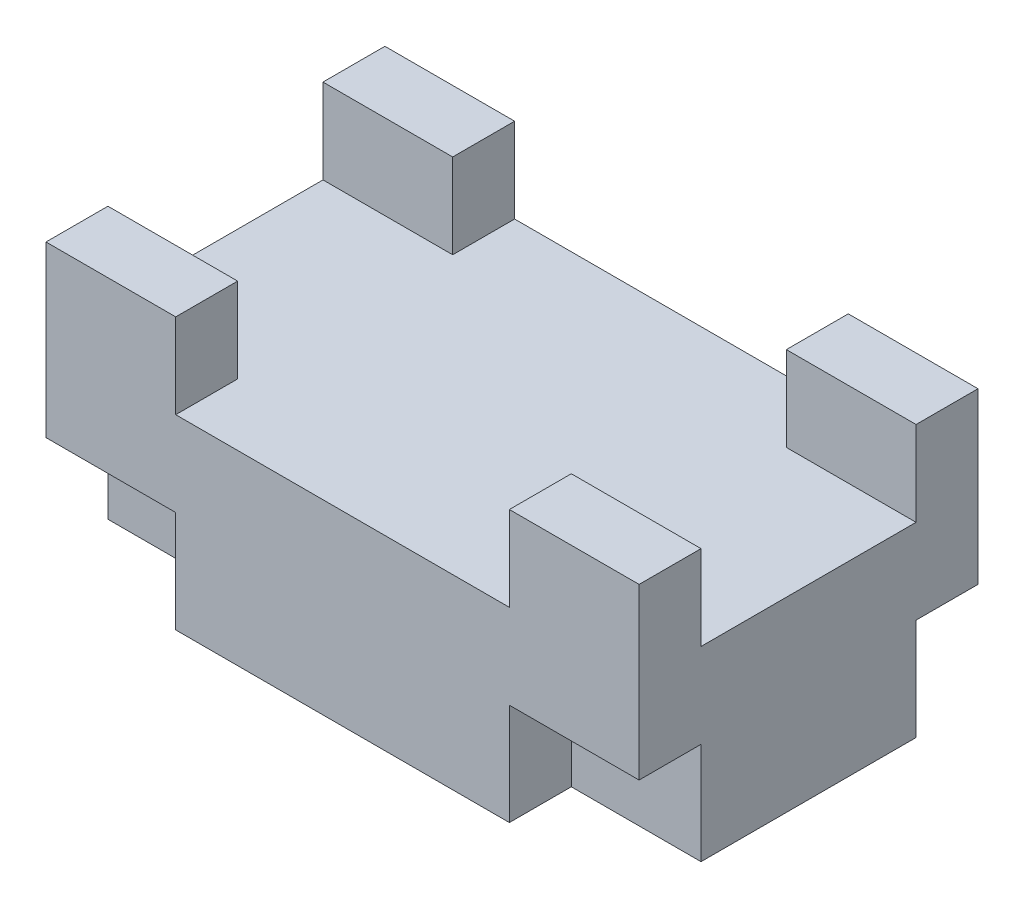
ISO-10303-21;
HEADER;
FILE_DESCRIPTION(('STEP AP214'),'2;1');
FILE_NAME('part.step','',(''),(''),'','','');
FILE_SCHEMA(('AUTOMOTIVE_DESIGN { 1 0 10303 214 1 1 1 1 }'));
ENDSEC;
DATA;
#1=APPLICATION_CONTEXT('core data for automotive mechanical design processes');
#2=APPLICATION_PROTOCOL_DEFINITION('international standard','automotive_design',2000,#1);
#3=PRODUCT_CONTEXT('',#1,'mechanical');
#4=PRODUCT('Part','Part','',(#3));
#5=PRODUCT_RELATED_PRODUCT_CATEGORY('part','',(#4));
#6=PRODUCT_DEFINITION_FORMATION('','',#4);
#7=PRODUCT_DEFINITION_CONTEXT('part definition',#1,'design');
#8=PRODUCT_DEFINITION('design','',#6,#7);
#9=PRODUCT_DEFINITION_SHAPE('','',#8);
#10=(LENGTH_UNIT() NAMED_UNIT(*) SI_UNIT(.MILLI.,.METRE.));
#11=(NAMED_UNIT(*) PLANE_ANGLE_UNIT() SI_UNIT($,.RADIAN.));
#12=(NAMED_UNIT(*) SI_UNIT($,.STERADIAN.) SOLID_ANGLE_UNIT());
#13=UNCERTAINTY_MEASURE_WITH_UNIT(LENGTH_MEASURE(1.E-05),#10,'distance_accuracy_value','');
#14=(GEOMETRIC_REPRESENTATION_CONTEXT(3) GLOBAL_UNCERTAINTY_ASSIGNED_CONTEXT((#13)) GLOBAL_UNIT_ASSIGNED_CONTEXT((#10,
#11,#12)) REPRESENTATION_CONTEXT('',''));
#15=CARTESIAN_POINT('',(0.,0.,0.));
#16=DIRECTION('',(0.,0.,1.));
#17=DIRECTION('',(1.,0.,0.));
#18=AXIS2_PLACEMENT_3D('',#15,#16,#17);
#19=CARTESIAN_POINT('',(0.,55.,-31.7241467208693));
#20=DIRECTION('',(0.,0.,-1.));
#21=DIRECTION('',(-1.,0.,0.));
#22=AXIS2_PLACEMENT_3D('',#19,#20,#21);
#23=PLANE('',#22);
#24=DIRECTION('',(0.,-1.,0.));
#25=VECTOR('',#24,1.);
#26=CARTESIAN_POINT('',(-87.5,55.,-31.7241467208693));
#27=LINE('',#26,#25);
#28=CARTESIAN_POINT('',(-87.5,30.,-31.7241467208693));
#29=VERTEX_POINT('',#28);
#30=CARTESIAN_POINT('',(-87.5,0.,-31.7241467208693));
#31=VERTEX_POINT('',#30);
#32=EDGE_CURVE('E11',#29,#31,#27,.T.);
#33=ORIENTED_EDGE('',*,*,#32,.F.);
#34=DIRECTION('',(1.,0.,0.));
#35=VECTOR('',#34,1.);
#36=CARTESIAN_POINT('',(-49.2266480162041,30.,-31.7241467208693));
#37=LINE('',#36,#35);
#38=CARTESIAN_POINT('',(-49.2266480162041,30.,-31.7241467208693));
#39=VERTEX_POINT('',#38);
#40=EDGE_CURVE('E62',#29,#39,#37,.T.);
#41=ORIENTED_EDGE('',*,*,#40,.T.);
#42=DIRECTION('',(0.,-1.,0.));
#43=VECTOR('',#42,1.);
#44=CARTESIAN_POINT('',(-49.2266480162041,55.,-31.7241467208693));
#45=LINE('',#44,#43);
#46=CARTESIAN_POINT('',(-49.2266480162041,0.,-31.7241467208693));
#47=VERTEX_POINT('',#46);
#48=EDGE_CURVE('E392',#39,#47,#45,.T.);
#49=ORIENTED_EDGE('',*,*,#48,.T.);
#50=DIRECTION('',(1.,0.,0.));
#51=VECTOR('',#50,1.);
#52=CARTESIAN_POINT('',(0.,0.,-31.7241467208693));
#53=LINE('',#52,#51);
#54=EDGE_CURVE('E349',#31,#47,#53,.T.);
#55=ORIENTED_EDGE('',*,*,#54,.F.);
#56=EDGE_LOOP('',(#33,#41,#49,#55));
#57=FACE_BOUND('',#56,.T.);
#58=ADVANCED_FACE('F39',(#57),#23,.T.);
#59=CARTESIAN_POINT('',(49.2266480162041,55.,0.));
#60=DIRECTION('',(1.,0.,0.));
#61=DIRECTION('',(0.,0.,-1.));
#62=AXIS2_PLACEMENT_3D('',#59,#60,#61);
#63=PLANE('',#62);
#64=DIRECTION('',(0.,-1.,0.));
#65=VECTOR('',#64,1.);
#66=CARTESIAN_POINT('',(49.2266480162041,55.,31.7241467208693));
#67=LINE('',#66,#65);
#68=CARTESIAN_POINT('',(49.2266480162041,30.,31.7241467208693));
#69=VERTEX_POINT('',#68);
#70=CARTESIAN_POINT('',(49.2266480162041,0.,31.7241467208693));
#71=VERTEX_POINT('',#70);
#72=EDGE_CURVE('E436',#69,#71,#67,.T.);
#73=ORIENTED_EDGE('',*,*,#72,.F.);
#74=DIRECTION('',(0.,0.,1.));
#75=VECTOR('',#74,1.);
#76=CARTESIAN_POINT('',(49.2266480162041,30.,50.));
#77=LINE('',#76,#75);
#78=CARTESIAN_POINT('',(49.2266480162041,30.,50.));
#79=VERTEX_POINT('',#78);
#80=EDGE_CURVE('E300',#69,#79,#77,.T.);
#81=ORIENTED_EDGE('',*,*,#80,.T.);
#82=DIRECTION('',(0.,-1.,0.));
#83=VECTOR('',#82,1.);
#84=CARTESIAN_POINT('',(49.2266480162041,55.,50.));
#85=LINE('',#84,#83);
#86=CARTESIAN_POINT('',(49.2266480162041,0.,50.));
#87=VERTEX_POINT('',#86);
#88=EDGE_CURVE('E437',#79,#87,#85,.T.);
#89=ORIENTED_EDGE('',*,*,#88,.T.);
#90=DIRECTION('',(0.,0.,1.));
#91=VECTOR('',#90,1.);
#92=CARTESIAN_POINT('',(49.2266480162041,0.,0.));
#93=LINE('',#92,#91);
#94=EDGE_CURVE('E403',#71,#87,#93,.T.);
#95=ORIENTED_EDGE('',*,*,#94,.F.);
#96=EDGE_LOOP('',(#73,#81,#89,#95));
#97=FACE_BOUND('',#96,.T.);
#98=ADVANCED_FACE('F479',(#97),#63,.T.);
#99=CARTESIAN_POINT('',(0.,55.,31.7241467208693));
#100=DIRECTION('',(0.,0.,1.));
#101=DIRECTION('',(1.,0.,0.));
#102=AXIS2_PLACEMENT_3D('',#99,#100,#101);
#103=PLANE('',#102);
#104=DIRECTION('',(0.,-1.,0.));
#105=VECTOR('',#104,1.);
#106=CARTESIAN_POINT('',(87.5,55.,31.7241467208693));
#107=LINE('',#106,#105);
#108=CARTESIAN_POINT('',(87.5,30.,31.7241467208693));
#109=VERTEX_POINT('',#108);
#110=CARTESIAN_POINT('',(87.5,0.,31.7241467208693));
#111=VERTEX_POINT('',#110);
#112=EDGE_CURVE('E432',#109,#111,#107,.T.);
#113=ORIENTED_EDGE('',*,*,#112,.F.);
#114=DIRECTION('',(-1.,0.,0.));
#115=VECTOR('',#114,1.);
#116=CARTESIAN_POINT('',(49.2266480162041,30.,31.7241467208693));
#117=LINE('',#116,#115);
#118=EDGE_CURVE('E52',#109,#69,#117,.T.);
#119=ORIENTED_EDGE('',*,*,#118,.T.);
#120=ORIENTED_EDGE('',*,*,#72,.T.);
#121=DIRECTION('',(-1.,0.,0.));
#122=VECTOR('',#121,1.);
#123=CARTESIAN_POINT('',(0.,0.,31.7241467208693));
#124=LINE('',#123,#122);
#125=EDGE_CURVE('E409',#111,#71,#124,.T.);
#126=ORIENTED_EDGE('',*,*,#125,.F.);
#127=EDGE_LOOP('',(#113,#119,#120,#126));
#128=FACE_BOUND('',#127,.T.);
#129=ADVANCED_FACE('F474',(#128),#103,.T.);
#130=CARTESIAN_POINT('',(-49.2266480162041,55.,0.));
#131=DIRECTION('',(-1.,0.,0.));
#132=DIRECTION('',(0.,0.,1.));
#133=AXIS2_PLACEMENT_3D('',#130,#131,#132);
#134=PLANE('',#133);
#135=ORIENTED_EDGE('',*,*,#48,.F.);
#136=DIRECTION('',(0.,0.,-1.));
#137=VECTOR('',#136,1.);
#138=CARTESIAN_POINT('',(-49.2266480162041,30.,-50.));
#139=LINE('',#138,#137);
#140=CARTESIAN_POINT('',(-49.2266480162041,30.,-50.));
#141=VERTEX_POINT('',#140);
#142=EDGE_CURVE('E279',#39,#141,#139,.T.);
#143=ORIENTED_EDGE('',*,*,#142,.T.);
#144=DIRECTION('',(0.,-1.,0.));
#145=VECTOR('',#144,1.);
#146=CARTESIAN_POINT('',(-49.2266480162041,55.,-50.));
#147=LINE('',#146,#145);
#148=CARTESIAN_POINT('',(-49.2266480162041,0.,-50.));
#149=VERTEX_POINT('',#148);
#150=EDGE_CURVE('E426',#141,#149,#147,.T.);
#151=ORIENTED_EDGE('',*,*,#150,.T.);
#152=DIRECTION('',(0.,0.,-1.));
#153=VECTOR('',#152,1.);
#154=CARTESIAN_POINT('',(-49.2266480162041,0.,0.));
#155=LINE('',#154,#153);
#156=EDGE_CURVE('E360',#47,#149,#155,.T.);
#157=ORIENTED_EDGE('',*,*,#156,.F.);
#158=EDGE_LOOP('',(#135,#143,#151,#157));
#159=FACE_BOUND('',#158,.T.);
#160=ADVANCED_FACE('F451',(#159),#134,.T.);
#161=CARTESIAN_POINT('',(-87.5,55.,0.));
#162=DIRECTION('',(-1.,0.,0.));
#163=DIRECTION('',(0.,0.,1.));
#164=AXIS2_PLACEMENT_3D('',#161,#162,#163);
#165=PLANE('',#164);
#166=DIRECTION('',(0.,0.,-1.));
#167=VECTOR('',#166,1.);
#168=CARTESIAN_POINT('',(-87.5,0.,0.));
#169=LINE('',#168,#167);
#170=CARTESIAN_POINT('',(-87.5,0.,31.7241467208693));
#171=VERTEX_POINT('',#170);
#172=EDGE_CURVE('E391',#171,#31,#169,.T.);
#173=ORIENTED_EDGE('',*,*,#172,.F.);
#174=DIRECTION('',(0.,-1.,0.));
#175=VECTOR('',#174,1.);
#176=CARTESIAN_POINT('',(-87.5,55.,31.7241467208693));
#177=LINE('',#176,#175);
#178=CARTESIAN_POINT('',(-87.5,30.,31.7241467208693));
#179=VERTEX_POINT('',#178);
#180=EDGE_CURVE('E46',#179,#171,#177,.T.);
#181=ORIENTED_EDGE('',*,*,#180,.F.);
#182=DIRECTION('',(0.,0.,1.));
#183=VECTOR('',#182,1.);
#184=CARTESIAN_POINT('',(-87.5,30.,31.7241467208693));
#185=LINE('',#184,#183);
#186=CARTESIAN_POINT('',(-87.5,30.,50.));
#187=VERTEX_POINT('',#186);
#188=EDGE_CURVE('E239',#179,#187,#185,.T.);
#189=ORIENTED_EDGE('',*,*,#188,.T.);
#190=DIRECTION('',(0.,1.,0.));
#191=VECTOR('',#190,1.);
#192=CARTESIAN_POINT('',(-87.5,30.,50.));
#193=LINE('',#192,#191);
#194=CARTESIAN_POINT('',(-87.5,80.,50.));
#195=VERTEX_POINT('',#194);
#196=EDGE_CURVE('E225',#187,#195,#193,.T.);
#197=ORIENTED_EDGE('',*,*,#196,.T.);
#198=DIRECTION('',(0.,0.,1.));
#199=VECTOR('',#198,1.);
#200=CARTESIAN_POINT('',(-87.5,80.,31.7241467208693));
#201=LINE('',#200,#199);
#202=CARTESIAN_POINT('',(-87.5,80.,31.7241467208693));
#203=VERTEX_POINT('',#202);
#204=EDGE_CURVE('E244',#203,#195,#201,.T.);
#205=ORIENTED_EDGE('',*,*,#204,.F.);
#206=DIRECTION('',(0.,1.,0.));
#207=VECTOR('',#206,1.);
#208=CARTESIAN_POINT('',(-87.5,30.,31.7241467208693));
#209=LINE('',#208,#207);
#210=CARTESIAN_POINT('',(-87.5,55.,31.7241467208693));
#211=VERTEX_POINT('',#210);
#212=EDGE_CURVE('E235',#211,#203,#209,.T.);
#213=ORIENTED_EDGE('',*,*,#212,.F.);
#214=DIRECTION('',(0.,0.,-1.));
#215=VECTOR('',#214,1.);
#216=CARTESIAN_POINT('',(-87.5,55.,0.));
#217=LINE('',#216,#215);
#218=CARTESIAN_POINT('',(-87.5,55.,-31.7241467208693));
#219=VERTEX_POINT('',#218);
#220=EDGE_CURVE('E357',#211,#219,#217,.T.);
#221=ORIENTED_EDGE('',*,*,#220,.T.);
#222=DIRECTION('',(0.,1.,0.));
#223=VECTOR('',#222,1.);
#224=CARTESIAN_POINT('',(-87.5,30.,-31.7241467208693));
#225=LINE('',#224,#223);
#226=CARTESIAN_POINT('',(-87.5,80.,-31.7241467208693));
#227=VERTEX_POINT('',#226);
#228=EDGE_CURVE('E266',#219,#227,#225,.T.);
#229=ORIENTED_EDGE('',*,*,#228,.T.);
#230=DIRECTION('',(0.,0.,1.));
#231=VECTOR('',#230,1.);
#232=CARTESIAN_POINT('',(-87.5,80.,-50.));
#233=LINE('',#232,#231);
#234=CARTESIAN_POINT('',(-87.5,80.,-50.));
#235=VERTEX_POINT('',#234);
#236=EDGE_CURVE('E231',#235,#227,#233,.T.);
#237=ORIENTED_EDGE('',*,*,#236,.F.);
#238=DIRECTION('',(0.,1.,0.));
#239=VECTOR('',#238,1.);
#240=CARTESIAN_POINT('',(-87.5,30.,-50.));
#241=LINE('',#240,#239);
#242=CARTESIAN_POINT('',(-87.5,30.,-50.));
#243=VERTEX_POINT('',#242);
#244=EDGE_CURVE('E272',#243,#235,#241,.T.);
#245=ORIENTED_EDGE('',*,*,#244,.F.);
#246=DIRECTION('',(0.,0.,1.));
#247=VECTOR('',#246,1.);
#248=CARTESIAN_POINT('',(-87.5,30.,-50.));
#249=LINE('',#248,#247);
#250=EDGE_CURVE('E282',#243,#29,#249,.T.);
#251=ORIENTED_EDGE('',*,*,#250,.T.);
#252=ORIENTED_EDGE('',*,*,#32,.T.);
#253=EDGE_LOOP('',(#173,#181,#189,#197,#205,#213,#221,#229,#237,#245,#251,#252));
#254=FACE_BOUND('',#253,.T.);
#255=ADVANCED_FACE('F249',(#254),#165,.T.);
#256=CARTESIAN_POINT('',(0.,55.,31.7241467208693));
#257=DIRECTION('',(0.,0.,-1.));
#258=DIRECTION('',(-1.,0.,0.));
#259=AXIS2_PLACEMENT_3D('',#256,#257,#258);
#260=PLANE('',#259);
#261=DIRECTION('',(0.,-1.,0.));
#262=VECTOR('',#261,1.);
#263=CARTESIAN_POINT('',(-49.2266480162041,55.,31.7241467208693));
#264=LINE('',#263,#262);
#265=CARTESIAN_POINT('',(-49.2266480162041,30.,31.7241467208693));
#266=VERTEX_POINT('',#265);
#267=CARTESIAN_POINT('',(-49.2266480162041,0.,31.7241467208693));
#268=VERTEX_POINT('',#267);
#269=EDGE_CURVE('E445',#266,#268,#264,.T.);
#270=ORIENTED_EDGE('',*,*,#269,.F.);
#271=DIRECTION('',(-1.,0.,0.));
#272=VECTOR('',#271,1.);
#273=CARTESIAN_POINT('',(-49.2266480162041,30.,31.7241467208693));
#274=LINE('',#273,#272);
#275=EDGE_CURVE('E247',#266,#179,#274,.T.);
#276=ORIENTED_EDGE('',*,*,#275,.T.);
#277=ORIENTED_EDGE('',*,*,#180,.T.);
#278=DIRECTION('',(1.,0.,0.));
#279=VECTOR('',#278,1.);
#280=CARTESIAN_POINT('',(0.,0.,31.7241467208693));
#281=LINE('',#280,#279);
#282=EDGE_CURVE('E399',#171,#268,#281,.T.);
#283=ORIENTED_EDGE('',*,*,#282,.T.);
#284=EDGE_LOOP('',(#270,#276,#277,#283));
#285=FACE_BOUND('',#284,.T.);
#286=ADVANCED_FACE('F447',(#285),#260,.F.);
#287=CARTESIAN_POINT('',(-49.2266480162041,55.,0.));
#288=DIRECTION('',(1.,0.,0.));
#289=DIRECTION('',(0.,0.,-1.));
#290=AXIS2_PLACEMENT_3D('',#287,#288,#289);
#291=PLANE('',#290);
#292=DIRECTION('',(0.,-1.,0.));
#293=VECTOR('',#292,1.);
#294=CARTESIAN_POINT('',(-49.2266480162041,55.,50.));
#295=LINE('',#294,#293);
#296=CARTESIAN_POINT('',(-49.2266480162041,30.,50.));
#297=VERTEX_POINT('',#296);
#298=CARTESIAN_POINT('',(-49.2266480162041,0.,50.));
#299=VERTEX_POINT('',#298);
#300=EDGE_CURVE('E439',#297,#299,#295,.T.);
#301=ORIENTED_EDGE('',*,*,#300,.F.);
#302=DIRECTION('',(0.,0.,-1.));
#303=VECTOR('',#302,1.);
#304=CARTESIAN_POINT('',(-49.2266480162041,30.,50.));
#305=LINE('',#304,#303);
#306=EDGE_CURVE('E245',#297,#266,#305,.T.);
#307=ORIENTED_EDGE('',*,*,#306,.T.);
#308=ORIENTED_EDGE('',*,*,#269,.T.);
#309=DIRECTION('',(0.,0.,1.));
#310=VECTOR('',#309,1.);
#311=CARTESIAN_POINT('',(-49.2266480162041,0.,0.));
#312=LINE('',#311,#310);
#313=EDGE_CURVE('E396',#268,#299,#312,.T.);
#314=ORIENTED_EDGE('',*,*,#313,.T.);
#315=EDGE_LOOP('',(#301,#307,#308,#314));
#316=FACE_BOUND('',#315,.T.);
#317=ADVANCED_FACE('F483',(#316),#291,.F.);
#318=CARTESIAN_POINT('',(0.,55.,50.));
#319=DIRECTION('',(0.,0.,-1.));
#320=DIRECTION('',(-1.,0.,0.));
#321=AXIS2_PLACEMENT_3D('',#318,#319,#320);
#322=PLANE('',#321);
#323=DIRECTION('',(1.,0.,0.));
#324=VECTOR('',#323,1.);
#325=CARTESIAN_POINT('',(0.,0.,50.));
#326=LINE('',#325,#324);
#327=EDGE_CURVE('E401',#299,#87,#326,.T.);
#328=ORIENTED_EDGE('',*,*,#327,.T.);
#329=ORIENTED_EDGE('',*,*,#88,.F.);
#330=DIRECTION('',(1.,0.,0.));
#331=VECTOR('',#330,1.);
#332=CARTESIAN_POINT('',(87.5,30.,50.));
#333=LINE('',#332,#331);
#334=CARTESIAN_POINT('',(87.5,30.,50.));
#335=VERTEX_POINT('',#334);
#336=EDGE_CURVE('E310',#79,#335,#333,.T.);
#337=ORIENTED_EDGE('',*,*,#336,.T.);
#338=DIRECTION('',(0.,1.,0.));
#339=VECTOR('',#338,1.);
#340=CARTESIAN_POINT('',(87.5,30.,50.));
#341=LINE('',#340,#339);
#342=CARTESIAN_POINT('',(87.5,80.,50.));
#343=VERTEX_POINT('',#342);
#344=EDGE_CURVE('E293',#335,#343,#341,.T.);
#345=ORIENTED_EDGE('',*,*,#344,.T.);
#346=DIRECTION('',(1.,0.,0.));
#347=VECTOR('',#346,1.);
#348=CARTESIAN_POINT('',(87.5,80.,50.));
#349=LINE('',#348,#347);
#350=CARTESIAN_POINT('',(49.2266480162041,80.,50.));
#351=VERTEX_POINT('',#350);
#352=EDGE_CURVE('E274',#351,#343,#349,.T.);
#353=ORIENTED_EDGE('',*,*,#352,.F.);
#354=DIRECTION('',(0.,1.,0.));
#355=VECTOR('',#354,1.);
#356=CARTESIAN_POINT('',(49.2266480162041,30.,50.));
#357=LINE('',#356,#355);
#358=CARTESIAN_POINT('',(49.2266480162041,55.,50.));
#359=VERTEX_POINT('',#358);
#360=EDGE_CURVE('E304',#359,#351,#357,.T.);
#361=ORIENTED_EDGE('',*,*,#360,.F.);
#362=DIRECTION('',(1.,0.,0.));
#363=VECTOR('',#362,1.);
#364=CARTESIAN_POINT('',(0.,55.,50.));
#365=LINE('',#364,#363);
#366=CARTESIAN_POINT('',(-49.2266480162041,55.,50.));
#367=VERTEX_POINT('',#366);
#368=EDGE_CURVE('E366',#367,#359,#365,.T.);
#369=ORIENTED_EDGE('',*,*,#368,.F.);
#370=DIRECTION('',(0.,1.,0.));
#371=VECTOR('',#370,1.);
#372=CARTESIAN_POINT('',(-49.2266480162041,30.,50.));
#373=LINE('',#372,#371);
#374=CARTESIAN_POINT('',(-49.2266480162041,80.,50.));
#375=VERTEX_POINT('',#374);
#376=EDGE_CURVE('E250',#367,#375,#373,.T.);
#377=ORIENTED_EDGE('',*,*,#376,.T.);
#378=DIRECTION('',(1.,0.,0.));
#379=VECTOR('',#378,1.);
#380=CARTESIAN_POINT('',(-87.5,80.,50.));
#381=LINE('',#380,#379);
#382=EDGE_CURVE('E226',#195,#375,#381,.T.);
#383=ORIENTED_EDGE('',*,*,#382,.F.);
#384=ORIENTED_EDGE('',*,*,#196,.F.);
#385=DIRECTION('',(1.,0.,0.));
#386=VECTOR('',#385,1.);
#387=CARTESIAN_POINT('',(-87.5,30.,50.));
#388=LINE('',#387,#386);
#389=EDGE_CURVE('E227',#187,#297,#388,.T.);
#390=ORIENTED_EDGE('',*,*,#389,.T.);
#391=ORIENTED_EDGE('',*,*,#300,.T.);
#392=EDGE_LOOP('',(#328,#329,#337,#345,#353,#361,#369,#377,#383,#384,#390,#391));
#393=FACE_BOUND('',#392,.T.);
#394=ADVANCED_FACE('F223',(#393),#322,.F.);
#395=CARTESIAN_POINT('',(87.5,55.,0.));
#396=DIRECTION('',(-1.,0.,0.));
#397=DIRECTION('',(0.,0.,1.));
#398=AXIS2_PLACEMENT_3D('',#395,#396,#397);
#399=PLANE('',#398);
#400=DIRECTION('',(0.,0.,-1.));
#401=VECTOR('',#400,1.);
#402=CARTESIAN_POINT('',(87.5,0.,0.));
#403=LINE('',#402,#401);
#404=CARTESIAN_POINT('',(87.5,0.,-31.7241467208693));
#405=VERTEX_POINT('',#404);
#406=EDGE_CURVE('E413',#111,#405,#403,.T.);
#407=ORIENTED_EDGE('',*,*,#406,.T.);
#408=DIRECTION('',(0.,-1.,0.));
#409=VECTOR('',#408,1.);
#410=CARTESIAN_POINT('',(87.5,55.,-31.7241467208693));
#411=LINE('',#410,#409);
#412=CARTESIAN_POINT('',(87.5,30.,-31.7241467208693));
#413=VERTEX_POINT('',#412);
#414=EDGE_CURVE('E435',#413,#405,#411,.T.);
#415=ORIENTED_EDGE('',*,*,#414,.F.);
#416=DIRECTION('',(0.,0.,-1.));
#417=VECTOR('',#416,1.);
#418=CARTESIAN_POINT('',(87.5,30.,-50.));
#419=LINE('',#418,#417);
#420=CARTESIAN_POINT('',(87.5,30.,-50.));
#421=VERTEX_POINT('',#420);
#422=EDGE_CURVE('E331',#413,#421,#419,.T.);
#423=ORIENTED_EDGE('',*,*,#422,.T.);
#424=DIRECTION('',(0.,1.,0.));
#425=VECTOR('',#424,1.);
#426=CARTESIAN_POINT('',(87.5,30.,-50.));
#427=LINE('',#426,#425);
#428=CARTESIAN_POINT('',(87.5,80.,-50.));
#429=VERTEX_POINT('',#428);
#430=EDGE_CURVE('E347',#421,#429,#427,.T.);
#431=ORIENTED_EDGE('',*,*,#430,.T.);
#432=DIRECTION('',(0.,0.,-1.));
#433=VECTOR('',#432,1.);
#434=CARTESIAN_POINT('',(87.5,80.,-50.));
#435=LINE('',#434,#433);
#436=CARTESIAN_POINT('',(87.5,80.,-31.7241467208693));
#437=VERTEX_POINT('',#436);
#438=EDGE_CURVE('E264',#437,#429,#435,.T.);
#439=ORIENTED_EDGE('',*,*,#438,.F.);
#440=DIRECTION('',(0.,1.,0.));
#441=VECTOR('',#440,1.);
#442=CARTESIAN_POINT('',(87.5,30.,-31.7241467208693));
#443=LINE('',#442,#441);
#444=CARTESIAN_POINT('',(87.5,55.,-31.7241467208693));
#445=VERTEX_POINT('',#444);
#446=EDGE_CURVE('E350',#445,#437,#443,.T.);
#447=ORIENTED_EDGE('',*,*,#446,.F.);
#448=DIRECTION('',(0.,0.,-1.));
#449=VECTOR('',#448,1.);
#450=CARTESIAN_POINT('',(87.5,55.,0.));
#451=LINE('',#450,#449);
#452=CARTESIAN_POINT('',(87.5,55.,31.7241467208693));
#453=VERTEX_POINT('',#452);
#454=EDGE_CURVE('E376',#453,#445,#451,.T.);
#455=ORIENTED_EDGE('',*,*,#454,.F.);
#456=DIRECTION('',(0.,1.,0.));
#457=VECTOR('',#456,1.);
#458=CARTESIAN_POINT('',(87.5,30.,31.7241467208693));
#459=LINE('',#458,#457);
#460=CARTESIAN_POINT('',(87.5,80.,31.7241467208693));
#461=VERTEX_POINT('',#460);
#462=EDGE_CURVE('E299',#453,#461,#459,.T.);
#463=ORIENTED_EDGE('',*,*,#462,.T.);
#464=DIRECTION('',(0.,0.,-1.));
#465=VECTOR('',#464,1.);
#466=CARTESIAN_POINT('',(87.5,80.,31.7241467208693));
#467=LINE('',#466,#465);
#468=EDGE_CURVE('E318',#343,#461,#467,.T.);
#469=ORIENTED_EDGE('',*,*,#468,.F.);
#470=ORIENTED_EDGE('',*,*,#344,.F.);
#471=DIRECTION('',(0.,0.,-1.));
#472=VECTOR('',#471,1.);
#473=CARTESIAN_POINT('',(87.5,30.,31.7241467208693));
#474=LINE('',#473,#472);
#475=EDGE_CURVE('E308',#335,#109,#474,.T.);
#476=ORIENTED_EDGE('',*,*,#475,.T.);
#477=ORIENTED_EDGE('',*,*,#112,.T.);
#478=EDGE_LOOP('',(#407,#415,#423,#431,#439,#447,#455,#463,#469,#470,#476,#477));
#479=FACE_BOUND('',#478,.T.);
#480=ADVANCED_FACE('F471',(#479),#399,.F.);
#481=CARTESIAN_POINT('',(0.,55.,-31.7241467208693));
#482=DIRECTION('',(0.,0.,1.));
#483=DIRECTION('',(1.,0.,0.));
#484=AXIS2_PLACEMENT_3D('',#481,#482,#483);
#485=PLANE('',#484);
#486=DIRECTION('',(0.,-1.,0.));
#487=VECTOR('',#486,1.);
#488=CARTESIAN_POINT('',(49.2266480162041,55.,-31.7241467208693));
#489=LINE('',#488,#487);
#490=CARTESIAN_POINT('',(49.2266480162041,30.,-31.7241467208693));
#491=VERTEX_POINT('',#490);
#492=CARTESIAN_POINT('',(49.2266480162041,0.,-31.7241467208693));
#493=VERTEX_POINT('',#492);
#494=EDGE_CURVE('E429',#491,#493,#489,.T.);
#495=ORIENTED_EDGE('',*,*,#494,.F.);
#496=DIRECTION('',(1.,0.,0.));
#497=VECTOR('',#496,1.);
#498=CARTESIAN_POINT('',(87.5,30.,-31.7241467208693));
#499=LINE('',#498,#497);
#500=EDGE_CURVE('E342',#491,#413,#499,.T.);
#501=ORIENTED_EDGE('',*,*,#500,.T.);
#502=ORIENTED_EDGE('',*,*,#414,.T.);
#503=DIRECTION('',(-1.,0.,0.));
#504=VECTOR('',#503,1.);
#505=CARTESIAN_POINT('',(0.,0.,-31.7241467208693));
#506=LINE('',#505,#504);
#507=EDGE_CURVE('E415',#405,#493,#506,.T.);
#508=ORIENTED_EDGE('',*,*,#507,.T.);
#509=EDGE_LOOP('',(#495,#501,#502,#508));
#510=FACE_BOUND('',#509,.T.);
#511=ADVANCED_FACE('F466',(#510),#485,.F.);
#512=CARTESIAN_POINT('',(49.2266480162041,55.,0.));
#513=DIRECTION('',(-1.,0.,0.));
#514=DIRECTION('',(0.,0.,1.));
#515=AXIS2_PLACEMENT_3D('',#512,#513,#514);
#516=PLANE('',#515);
#517=DIRECTION('',(0.,-1.,0.));
#518=VECTOR('',#517,1.);
#519=CARTESIAN_POINT('',(49.2266480162041,55.,-50.));
#520=LINE('',#519,#518);
#521=CARTESIAN_POINT('',(49.2266480162041,30.,-50.));
#522=VERTEX_POINT('',#521);
#523=CARTESIAN_POINT('',(49.2266480162041,0.,-50.));
#524=VERTEX_POINT('',#523);
#525=EDGE_CURVE('E428',#522,#524,#520,.T.);
#526=ORIENTED_EDGE('',*,*,#525,.F.);
#527=DIRECTION('',(0.,0.,1.));
#528=VECTOR('',#527,1.);
#529=CARTESIAN_POINT('',(49.2266480162041,30.,-31.7241467208693));
#530=LINE('',#529,#528);
#531=EDGE_CURVE('E338',#522,#491,#530,.T.);
#532=ORIENTED_EDGE('',*,*,#531,.T.);
#533=ORIENTED_EDGE('',*,*,#494,.T.);
#534=DIRECTION('',(0.,0.,-1.));
#535=VECTOR('',#534,1.);
#536=CARTESIAN_POINT('',(49.2266480162041,0.,0.));
#537=LINE('',#536,#535);
#538=EDGE_CURVE('E417',#493,#524,#537,.T.);
#539=ORIENTED_EDGE('',*,*,#538,.T.);
#540=EDGE_LOOP('',(#526,#532,#533,#539));
#541=FACE_BOUND('',#540,.T.);
#542=ADVANCED_FACE('F469',(#541),#516,.F.);
#543=CARTESIAN_POINT('',(0.,55.,-50.));
#544=DIRECTION('',(0.,0.,-1.));
#545=DIRECTION('',(-1.,0.,0.));
#546=AXIS2_PLACEMENT_3D('',#543,#544,#545);
#547=PLANE('',#546);
#548=DIRECTION('',(1.,0.,0.));
#549=VECTOR('',#548,1.);
#550=CARTESIAN_POINT('',(0.,0.,-50.));
#551=LINE('',#550,#549);
#552=EDGE_CURVE('E419',#149,#524,#551,.T.);
#553=ORIENTED_EDGE('',*,*,#552,.F.);
#554=ORIENTED_EDGE('',*,*,#150,.F.);
#555=DIRECTION('',(-1.,0.,0.));
#556=VECTOR('',#555,1.);
#557=CARTESIAN_POINT('',(-49.2266480162041,30.,-50.));
#558=LINE('',#557,#556);
#559=EDGE_CURVE('E268',#141,#243,#558,.T.);
#560=ORIENTED_EDGE('',*,*,#559,.T.);
#561=ORIENTED_EDGE('',*,*,#244,.T.);
#562=DIRECTION('',(-1.,0.,0.));
#563=VECTOR('',#562,1.);
#564=CARTESIAN_POINT('',(-49.2266480162041,80.,-50.));
#565=LINE('',#564,#563);
#566=CARTESIAN_POINT('',(-49.2266480162041,80.,-50.));
#567=VERTEX_POINT('',#566);
#568=EDGE_CURVE('E281',#567,#235,#565,.T.);
#569=ORIENTED_EDGE('',*,*,#568,.F.);
#570=DIRECTION('',(0.,1.,0.));
#571=VECTOR('',#570,1.);
#572=CARTESIAN_POINT('',(-49.2266480162041,30.,-50.));
#573=LINE('',#572,#571);
#574=CARTESIAN_POINT('',(-49.2266480162041,55.,-50.));
#575=VERTEX_POINT('',#574);
#576=EDGE_CURVE('E271',#575,#567,#573,.T.);
#577=ORIENTED_EDGE('',*,*,#576,.F.);
#578=DIRECTION('',(1.,0.,0.));
#579=VECTOR('',#578,1.);
#580=CARTESIAN_POINT('',(0.,55.,-50.));
#581=LINE('',#580,#579);
#582=CARTESIAN_POINT('',(49.2266480162041,55.,-50.));
#583=VERTEX_POINT('',#582);
#584=EDGE_CURVE('E384',#575,#583,#581,.T.);
#585=ORIENTED_EDGE('',*,*,#584,.T.);
#586=DIRECTION('',(0.,1.,0.));
#587=VECTOR('',#586,1.);
#588=CARTESIAN_POINT('',(49.2266480162041,30.,-50.));
#589=LINE('',#588,#587);
#590=CARTESIAN_POINT('',(49.2266480162041,80.,-50.));
#591=VERTEX_POINT('',#590);
#592=EDGE_CURVE('E355',#583,#591,#589,.T.);
#593=ORIENTED_EDGE('',*,*,#592,.T.);
#594=DIRECTION('',(-1.,0.,0.));
#595=VECTOR('',#594,1.);
#596=CARTESIAN_POINT('',(49.2266480162041,80.,-50.));
#597=LINE('',#596,#595);
#598=EDGE_CURVE('E324',#429,#591,#597,.T.);
#599=ORIENTED_EDGE('',*,*,#598,.F.);
#600=ORIENTED_EDGE('',*,*,#430,.F.);
#601=DIRECTION('',(-1.,0.,0.));
#602=VECTOR('',#601,1.);
#603=CARTESIAN_POINT('',(49.2266480162041,30.,-50.));
#604=LINE('',#603,#602);
#605=EDGE_CURVE('E340',#421,#522,#604,.T.);
#606=ORIENTED_EDGE('',*,*,#605,.T.);
#607=ORIENTED_EDGE('',*,*,#525,.T.);
#608=EDGE_LOOP('',(#553,#554,#560,#561,#569,#577,#585,#593,#599,#600,#606,#607));
#609=FACE_BOUND('',#608,.T.);
#610=ADVANCED_FACE('F462',(#609),#547,.T.);
#611=CARTESIAN_POINT('',(0.,55.,0.));
#612=DIRECTION('',(0.,1.,0.));
#613=DIRECTION('',(0.,0.,1.));
#614=AXIS2_PLACEMENT_3D('',#611,#612,#613);
#615=PLANE('',#614);
#616=DIRECTION('',(1.,0.,0.));
#617=VECTOR('',#616,1.);
#618=CARTESIAN_POINT('',(0.,55.,-31.7241467208693));
#619=LINE('',#618,#617);
#620=CARTESIAN_POINT('',(-49.2266480162041,55.,-31.7241467208693));
#621=VERTEX_POINT('',#620);
#622=EDGE_CURVE('E353',#219,#621,#619,.T.);
#623=ORIENTED_EDGE('',*,*,#622,.F.);
#624=ORIENTED_EDGE('',*,*,#220,.F.);
#625=DIRECTION('',(1.,0.,0.));
#626=VECTOR('',#625,1.);
#627=CARTESIAN_POINT('',(0.,55.,31.7241467208693));
#628=LINE('',#627,#626);
#629=CARTESIAN_POINT('',(-49.2266480162041,55.,31.7241467208693));
#630=VERTEX_POINT('',#629);
#631=EDGE_CURVE('E362',#211,#630,#628,.T.);
#632=ORIENTED_EDGE('',*,*,#631,.T.);
#633=DIRECTION('',(0.,0.,1.));
#634=VECTOR('',#633,1.);
#635=CARTESIAN_POINT('',(-49.2266480162041,55.,0.));
#636=LINE('',#635,#634);
#637=EDGE_CURVE('E364',#630,#367,#636,.T.);
#638=ORIENTED_EDGE('',*,*,#637,.T.);
#639=ORIENTED_EDGE('',*,*,#368,.T.);
#640=DIRECTION('',(0.,0.,1.));
#641=VECTOR('',#640,1.);
#642=CARTESIAN_POINT('',(49.2266480162041,55.,0.));
#643=LINE('',#642,#641);
#644=CARTESIAN_POINT('',(49.2266480162041,55.,31.7241467208693));
#645=VERTEX_POINT('',#644);
#646=EDGE_CURVE('E367',#645,#359,#643,.T.);
#647=ORIENTED_EDGE('',*,*,#646,.F.);
#648=DIRECTION('',(-1.,0.,0.));
#649=VECTOR('',#648,1.);
#650=CARTESIAN_POINT('',(0.,55.,31.7241467208693));
#651=LINE('',#650,#649);
#652=EDGE_CURVE('E373',#453,#645,#651,.T.);
#653=ORIENTED_EDGE('',*,*,#652,.F.);
#654=ORIENTED_EDGE('',*,*,#454,.T.);
#655=DIRECTION('',(-1.,0.,0.));
#656=VECTOR('',#655,1.);
#657=CARTESIAN_POINT('',(0.,55.,-31.7241467208693));
#658=LINE('',#657,#656);
#659=CARTESIAN_POINT('',(49.2266480162041,55.,-31.7241467208693));
#660=VERTEX_POINT('',#659);
#661=EDGE_CURVE('E377',#445,#660,#658,.T.);
#662=ORIENTED_EDGE('',*,*,#661,.T.);
#663=DIRECTION('',(0.,0.,-1.));
#664=VECTOR('',#663,1.);
#665=CARTESIAN_POINT('',(49.2266480162041,55.,0.));
#666=LINE('',#665,#664);
#667=EDGE_CURVE('E385',#660,#583,#666,.T.);
#668=ORIENTED_EDGE('',*,*,#667,.T.);
#669=ORIENTED_EDGE('',*,*,#584,.F.);
#670=DIRECTION('',(0.,0.,-1.));
#671=VECTOR('',#670,1.);
#672=CARTESIAN_POINT('',(-49.2266480162041,55.,0.));
#673=LINE('',#672,#671);
#674=EDGE_CURVE('E389',#621,#575,#673,.T.);
#675=ORIENTED_EDGE('',*,*,#674,.F.);
#676=EDGE_LOOP('',(#623,#624,#632,#638,#639,#647,#653,#654,#662,#668,#669,#675));
#677=FACE_BOUND('',#676,.T.);
#678=ADVANCED_FACE('F512',(#677),#615,.T.);
#679=CARTESIAN_POINT('',(0.,0.,0.));
#680=DIRECTION('',(0.,1.,0.));
#681=DIRECTION('',(0.,0.,1.));
#682=AXIS2_PLACEMENT_3D('',#679,#680,#681);
#683=PLANE('',#682);
#684=ORIENTED_EDGE('',*,*,#54,.T.);
#685=ORIENTED_EDGE('',*,*,#156,.T.);
#686=ORIENTED_EDGE('',*,*,#552,.T.);
#687=ORIENTED_EDGE('',*,*,#538,.F.);
#688=ORIENTED_EDGE('',*,*,#507,.F.);
#689=ORIENTED_EDGE('',*,*,#406,.F.);
#690=ORIENTED_EDGE('',*,*,#125,.T.);
#691=ORIENTED_EDGE('',*,*,#94,.T.);
#692=ORIENTED_EDGE('',*,*,#327,.F.);
#693=ORIENTED_EDGE('',*,*,#313,.F.);
#694=ORIENTED_EDGE('',*,*,#282,.F.);
#695=ORIENTED_EDGE('',*,*,#172,.T.);
#696=EDGE_LOOP('',(#684,#685,#686,#687,#688,#689,#690,#691,#692,#693,#694,#695));
#697=FACE_BOUND('',#696,.T.);
#698=ADVANCED_FACE('F446',(#697),#683,.F.);
#699=CARTESIAN_POINT('',(87.5,30.,-31.7241467208693));
#700=DIRECTION('',(0.,0.,1.));
#701=DIRECTION('',(1.,0.,0.));
#702=AXIS2_PLACEMENT_3D('',#699,#700,#701);
#703=PLANE('',#702);
#704=DIRECTION('',(0.,1.,0.));
#705=VECTOR('',#704,1.);
#706=CARTESIAN_POINT('',(49.2266480162041,30.,-31.7241467208693));
#707=LINE('',#706,#705);
#708=CARTESIAN_POINT('',(49.2266480162041,80.,-31.7241467208693));
#709=VERTEX_POINT('',#708);
#710=EDGE_CURVE('E348',#660,#709,#707,.T.);
#711=ORIENTED_EDGE('',*,*,#710,.F.);
#712=ORIENTED_EDGE('',*,*,#661,.F.);
#713=ORIENTED_EDGE('',*,*,#446,.T.);
#714=DIRECTION('',(1.,0.,0.));
#715=VECTOR('',#714,1.);
#716=CARTESIAN_POINT('',(87.5,80.,-31.7241467208693));
#717=LINE('',#716,#715);
#718=EDGE_CURVE('E332',#709,#437,#717,.T.);
#719=ORIENTED_EDGE('',*,*,#718,.F.);
#720=EDGE_LOOP('',(#711,#712,#713,#719));
#721=FACE_BOUND('',#720,.T.);
#722=ADVANCED_FACE('F513',(#721),#703,.T.);
#723=CARTESIAN_POINT('',(49.2266480162041,30.,-31.7241467208693));
#724=DIRECTION('',(-1.,0.,0.));
#725=DIRECTION('',(0.,0.,1.));
#726=AXIS2_PLACEMENT_3D('',#723,#724,#725);
#727=PLANE('',#726);
#728=ORIENTED_EDGE('',*,*,#592,.F.);
#729=ORIENTED_EDGE('',*,*,#667,.F.);
#730=ORIENTED_EDGE('',*,*,#710,.T.);
#731=DIRECTION('',(0.,0.,1.));
#732=VECTOR('',#731,1.);
#733=CARTESIAN_POINT('',(49.2266480162041,80.,-31.7241467208693));
#734=LINE('',#733,#732);
#735=EDGE_CURVE('E327',#591,#709,#734,.T.);
#736=ORIENTED_EDGE('',*,*,#735,.F.);
#737=EDGE_LOOP('',(#728,#729,#730,#736));
#738=FACE_BOUND('',#737,.T.);
#739=ADVANCED_FACE('F516',(#738),#727,.T.);
#740=CARTESIAN_POINT('',(0.,30.,0.));
#741=DIRECTION('',(0.,-1.,0.));
#742=DIRECTION('',(0.,0.,-1.));
#743=AXIS2_PLACEMENT_3D('',#740,#741,#742);
#744=PLANE('',#743);
#745=ORIENTED_EDGE('',*,*,#422,.F.);
#746=ORIENTED_EDGE('',*,*,#500,.F.);
#747=ORIENTED_EDGE('',*,*,#531,.F.);
#748=ORIENTED_EDGE('',*,*,#605,.F.);
#749=EDGE_LOOP('',(#745,#746,#747,#748));
#750=FACE_BOUND('',#749,.T.);
#751=ADVANCED_FACE('F524',(#750),#744,.T.);
#752=CARTESIAN_POINT('',(0.,80.,0.));
#753=DIRECTION('',(0.,-1.,0.));
#754=DIRECTION('',(0.,0.,-1.));
#755=AXIS2_PLACEMENT_3D('',#752,#753,#754);
#756=PLANE('',#755);
#757=ORIENTED_EDGE('',*,*,#438,.T.);
#758=ORIENTED_EDGE('',*,*,#598,.T.);
#759=ORIENTED_EDGE('',*,*,#735,.T.);
#760=ORIENTED_EDGE('',*,*,#718,.T.);
#761=EDGE_LOOP('',(#757,#758,#759,#760));
#762=FACE_BOUND('',#761,.T.);
#763=ADVANCED_FACE('F530',(#762),#756,.F.);
#764=CARTESIAN_POINT('',(-49.2266480162041,30.,31.7241467208693));
#765=DIRECTION('',(0.,0.,-1.));
#766=DIRECTION('',(-1.,0.,0.));
#767=AXIS2_PLACEMENT_3D('',#764,#765,#766);
#768=PLANE('',#767);
#769=DIRECTION('',(0.,1.,0.));
#770=VECTOR('',#769,1.);
#771=CARTESIAN_POINT('',(-49.2266480162041,30.,31.7241467208693));
#772=LINE('',#771,#770);
#773=CARTESIAN_POINT('',(-49.2266480162041,80.,31.7241467208693));
#774=VERTEX_POINT('',#773);
#775=EDGE_CURVE('E252',#630,#774,#772,.T.);
#776=ORIENTED_EDGE('',*,*,#775,.F.);
#777=ORIENTED_EDGE('',*,*,#631,.F.);
#778=ORIENTED_EDGE('',*,*,#212,.T.);
#779=DIRECTION('',(-1.,0.,0.));
#780=VECTOR('',#779,1.);
#781=CARTESIAN_POINT('',(-49.2266480162041,80.,31.7241467208693));
#782=LINE('',#781,#780);
#783=EDGE_CURVE('E256',#774,#203,#782,.T.);
#784=ORIENTED_EDGE('',*,*,#783,.F.);
#785=EDGE_LOOP('',(#776,#777,#778,#784));
#786=FACE_BOUND('',#785,.T.);
#787=ADVANCED_FACE('F531',(#786),#768,.T.);
#788=CARTESIAN_POINT('',(-49.2266480162041,30.,50.));
#789=DIRECTION('',(1.,0.,0.));
#790=DIRECTION('',(0.,0.,-1.));
#791=AXIS2_PLACEMENT_3D('',#788,#789,#790);
#792=PLANE('',#791);
#793=ORIENTED_EDGE('',*,*,#376,.F.);
#794=ORIENTED_EDGE('',*,*,#637,.F.);
#795=ORIENTED_EDGE('',*,*,#775,.T.);
#796=DIRECTION('',(0.,0.,-1.));
#797=VECTOR('',#796,1.);
#798=CARTESIAN_POINT('',(-49.2266480162041,80.,50.));
#799=LINE('',#798,#797);
#800=EDGE_CURVE('E261',#375,#774,#799,.T.);
#801=ORIENTED_EDGE('',*,*,#800,.F.);
#802=EDGE_LOOP('',(#793,#794,#795,#801));
#803=FACE_BOUND('',#802,.T.);
#804=ADVANCED_FACE('F574',(#803),#792,.T.);
#805=CARTESIAN_POINT('',(0.,30.,0.));
#806=DIRECTION('',(0.,1.,0.));
#807=DIRECTION('',(0.,0.,1.));
#808=AXIS2_PLACEMENT_3D('',#805,#806,#807);
#809=PLANE('',#808);
#810=ORIENTED_EDGE('',*,*,#389,.F.);
#811=ORIENTED_EDGE('',*,*,#188,.F.);
#812=ORIENTED_EDGE('',*,*,#275,.F.);
#813=ORIENTED_EDGE('',*,*,#306,.F.);
#814=EDGE_LOOP('',(#810,#811,#812,#813));
#815=FACE_BOUND('',#814,.T.);
#816=ADVANCED_FACE('F236',(#815),#809,.F.);
#817=CARTESIAN_POINT('',(0.,80.,0.));
#818=DIRECTION('',(0.,1.,0.));
#819=DIRECTION('',(0.,0.,1.));
#820=AXIS2_PLACEMENT_3D('',#817,#818,#819);
#821=PLANE('',#820);
#822=ORIENTED_EDGE('',*,*,#382,.T.);
#823=ORIENTED_EDGE('',*,*,#800,.T.);
#824=ORIENTED_EDGE('',*,*,#783,.T.);
#825=ORIENTED_EDGE('',*,*,#204,.T.);
#826=EDGE_LOOP('',(#822,#823,#824,#825));
#827=FACE_BOUND('',#826,.T.);
#828=ADVANCED_FACE('F562',(#827),#821,.T.);
#829=CARTESIAN_POINT('',(-49.2266480162041,30.,-50.));
#830=DIRECTION('',(1.,0.,0.));
#831=DIRECTION('',(0.,0.,-1.));
#832=AXIS2_PLACEMENT_3D('',#829,#830,#831);
#833=PLANE('',#832);
#834=DIRECTION('',(0.,1.,0.));
#835=VECTOR('',#834,1.);
#836=CARTESIAN_POINT('',(-49.2266480162041,30.,-31.7241467208693));
#837=LINE('',#836,#835);
#838=CARTESIAN_POINT('',(-49.2266480162041,80.,-31.7241467208693));
#839=VERTEX_POINT('',#838);
#840=EDGE_CURVE('E267',#621,#839,#837,.T.);
#841=ORIENTED_EDGE('',*,*,#840,.F.);
#842=ORIENTED_EDGE('',*,*,#674,.T.);
#843=ORIENTED_EDGE('',*,*,#576,.T.);
#844=DIRECTION('',(0.,0.,-1.));
#845=VECTOR('',#844,1.);
#846=CARTESIAN_POINT('',(-49.2266480162041,80.,-50.));
#847=LINE('',#846,#845);
#848=EDGE_CURVE('E289',#839,#567,#847,.T.);
#849=ORIENTED_EDGE('',*,*,#848,.F.);
#850=EDGE_LOOP('',(#841,#842,#843,#849));
#851=FACE_BOUND('',#850,.T.);
#852=ADVANCED_FACE('F558',(#851),#833,.T.);
#853=CARTESIAN_POINT('',(-49.2266480162041,30.,-31.7241467208693));
#854=DIRECTION('',(0.,0.,1.));
#855=DIRECTION('',(1.,0.,0.));
#856=AXIS2_PLACEMENT_3D('',#853,#854,#855);
#857=PLANE('',#856);
#858=ORIENTED_EDGE('',*,*,#228,.F.);
#859=ORIENTED_EDGE('',*,*,#622,.T.);
#860=ORIENTED_EDGE('',*,*,#840,.T.);
#861=DIRECTION('',(1.,0.,0.));
#862=VECTOR('',#861,1.);
#863=CARTESIAN_POINT('',(-49.2266480162041,80.,-31.7241467208693));
#864=LINE('',#863,#862);
#865=EDGE_CURVE('E286',#227,#839,#864,.T.);
#866=ORIENTED_EDGE('',*,*,#865,.F.);
#867=EDGE_LOOP('',(#858,#859,#860,#866));
#868=FACE_BOUND('',#867,.T.);
#869=ADVANCED_FACE('F559',(#868),#857,.T.);
#870=CARTESIAN_POINT('',(0.,30.,0.));
#871=DIRECTION('',(0.,-1.,0.));
#872=DIRECTION('',(0.,0.,-1.));
#873=AXIS2_PLACEMENT_3D('',#870,#871,#872);
#874=PLANE('',#873);
#875=ORIENTED_EDGE('',*,*,#250,.F.);
#876=ORIENTED_EDGE('',*,*,#559,.F.);
#877=ORIENTED_EDGE('',*,*,#142,.F.);
#878=ORIENTED_EDGE('',*,*,#40,.F.);
#879=EDGE_LOOP('',(#875,#876,#877,#878));
#880=FACE_BOUND('',#879,.T.);
#881=ADVANCED_FACE('F551',(#880),#874,.T.);
#882=CARTESIAN_POINT('',(0.,80.,0.));
#883=DIRECTION('',(0.,-1.,0.));
#884=DIRECTION('',(0.,0.,-1.));
#885=AXIS2_PLACEMENT_3D('',#882,#883,#884);
#886=PLANE('',#885);
#887=ORIENTED_EDGE('',*,*,#236,.T.);
#888=ORIENTED_EDGE('',*,*,#865,.T.);
#889=ORIENTED_EDGE('',*,*,#848,.T.);
#890=ORIENTED_EDGE('',*,*,#568,.T.);
#891=EDGE_LOOP('',(#887,#888,#889,#890));
#892=FACE_BOUND('',#891,.T.);
#893=ADVANCED_FACE('F550',(#892),#886,.F.);
#894=CARTESIAN_POINT('',(49.2266480162041,30.,50.));
#895=DIRECTION('',(-1.,0.,0.));
#896=DIRECTION('',(0.,0.,1.));
#897=AXIS2_PLACEMENT_3D('',#894,#895,#896);
#898=PLANE('',#897);
#899=DIRECTION('',(0.,1.,0.));
#900=VECTOR('',#899,1.);
#901=CARTESIAN_POINT('',(49.2266480162041,30.,31.7241467208693));
#902=LINE('',#901,#900);
#903=CARTESIAN_POINT('',(49.2266480162041,80.,31.7241467208693));
#904=VERTEX_POINT('',#903);
#905=EDGE_CURVE('E298',#645,#904,#902,.T.);
#906=ORIENTED_EDGE('',*,*,#905,.F.);
#907=ORIENTED_EDGE('',*,*,#646,.T.);
#908=ORIENTED_EDGE('',*,*,#360,.T.);
#909=DIRECTION('',(0.,0.,1.));
#910=VECTOR('',#909,1.);
#911=CARTESIAN_POINT('',(49.2266480162041,80.,50.));
#912=LINE('',#911,#910);
#913=EDGE_CURVE('E315',#904,#351,#912,.T.);
#914=ORIENTED_EDGE('',*,*,#913,.F.);
#915=EDGE_LOOP('',(#906,#907,#908,#914));
#916=FACE_BOUND('',#915,.T.);
#917=ADVANCED_FACE('F542',(#916),#898,.T.);
#918=CARTESIAN_POINT('',(49.2266480162041,30.,31.7241467208693));
#919=DIRECTION('',(0.,0.,-1.));
#920=DIRECTION('',(-1.,0.,0.));
#921=AXIS2_PLACEMENT_3D('',#918,#919,#920);
#922=PLANE('',#921);
#923=ORIENTED_EDGE('',*,*,#462,.F.);
#924=ORIENTED_EDGE('',*,*,#652,.T.);
#925=ORIENTED_EDGE('',*,*,#905,.T.);
#926=DIRECTION('',(-1.,0.,0.));
#927=VECTOR('',#926,1.);
#928=CARTESIAN_POINT('',(49.2266480162041,80.,31.7241467208693));
#929=LINE('',#928,#927);
#930=EDGE_CURVE('E312',#461,#904,#929,.T.);
#931=ORIENTED_EDGE('',*,*,#930,.F.);
#932=EDGE_LOOP('',(#923,#924,#925,#931));
#933=FACE_BOUND('',#932,.T.);
#934=ADVANCED_FACE('F545',(#933),#922,.T.);
#935=CARTESIAN_POINT('',(0.,30.,0.));
#936=DIRECTION('',(0.,-1.,0.));
#937=DIRECTION('',(0.,0.,-1.));
#938=AXIS2_PLACEMENT_3D('',#935,#936,#937);
#939=PLANE('',#938);
#940=ORIENTED_EDGE('',*,*,#336,.F.);
#941=ORIENTED_EDGE('',*,*,#80,.F.);
#942=ORIENTED_EDGE('',*,*,#118,.F.);
#943=ORIENTED_EDGE('',*,*,#475,.F.);
#944=EDGE_LOOP('',(#940,#941,#942,#943));
#945=FACE_BOUND('',#944,.T.);
#946=ADVANCED_FACE('F538',(#945),#939,.T.);
#947=CARTESIAN_POINT('',(0.,80.,0.));
#948=DIRECTION('',(0.,-1.,0.));
#949=DIRECTION('',(0.,0.,-1.));
#950=AXIS2_PLACEMENT_3D('',#947,#948,#949);
#951=PLANE('',#950);
#952=ORIENTED_EDGE('',*,*,#352,.T.);
#953=ORIENTED_EDGE('',*,*,#468,.T.);
#954=ORIENTED_EDGE('',*,*,#930,.T.);
#955=ORIENTED_EDGE('',*,*,#913,.T.);
#956=EDGE_LOOP('',(#952,#953,#954,#955));
#957=FACE_BOUND('',#956,.T.);
#958=ADVANCED_FACE('F532',(#957),#951,.F.);
#959=CLOSED_SHELL('',(#58,#98,#129,#160,#255,#286,#317,#394,#480,#511,#542,#610,#678,#698,#722,
#739,#751,#763,#787,#804,#816,#828,#852,#869,#881,#893,#917,#934,#946,#958));
#960=MANIFOLD_SOLID_BREP('B2',#959);
#961=ADVANCED_BREP_SHAPE_REPRESENTATION('',(#18,#960),#14);
#962=SHAPE_DEFINITION_REPRESENTATION(#9,#961);
ENDSEC;
END-ISO-10303-21;
